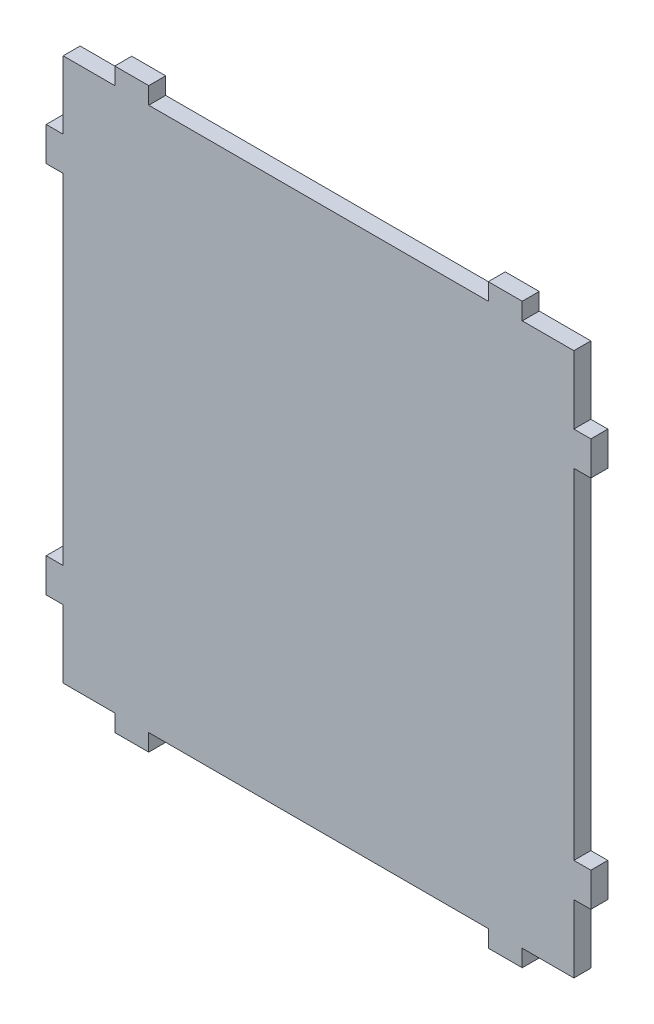
ISO-10303-21;
HEADER;
FILE_DESCRIPTION(('STEP AP214'),'2;1');
FILE_NAME('part.step','',(''),(''),'','','');
FILE_SCHEMA(('AUTOMOTIVE_DESIGN { 1 0 10303 214 1 1 1 1 }'));
ENDSEC;
DATA;
#1=APPLICATION_CONTEXT('core data for automotive mechanical design processes');
#2=APPLICATION_PROTOCOL_DEFINITION('international standard','automotive_design',2000,#1);
#3=PRODUCT_CONTEXT('',#1,'mechanical');
#4=PRODUCT('Part','Part','',(#3));
#5=PRODUCT_RELATED_PRODUCT_CATEGORY('part','',(#4));
#6=PRODUCT_DEFINITION_FORMATION('','',#4);
#7=PRODUCT_DEFINITION_CONTEXT('part definition',#1,'design');
#8=PRODUCT_DEFINITION('design','',#6,#7);
#9=PRODUCT_DEFINITION_SHAPE('','',#8);
#10=(LENGTH_UNIT() NAMED_UNIT(*) SI_UNIT(.MILLI.,.METRE.));
#11=(NAMED_UNIT(*) PLANE_ANGLE_UNIT() SI_UNIT($,.RADIAN.));
#12=(NAMED_UNIT(*) SI_UNIT($,.STERADIAN.) SOLID_ANGLE_UNIT());
#13=UNCERTAINTY_MEASURE_WITH_UNIT(LENGTH_MEASURE(1.E-05),#10,'distance_accuracy_value','');
#14=(GEOMETRIC_REPRESENTATION_CONTEXT(3) GLOBAL_UNCERTAINTY_ASSIGNED_CONTEXT((#13)) GLOBAL_UNIT_ASSIGNED_CONTEXT((#10,
#11,#12)) REPRESENTATION_CONTEXT('',''));
#15=CARTESIAN_POINT('',(0.,0.,0.));
#16=DIRECTION('',(0.,0.,1.));
#17=DIRECTION('',(1.,0.,0.));
#18=AXIS2_PLACEMENT_3D('',#15,#16,#17);
#19=CARTESIAN_POINT('',(-3.17500000000001,0.,3.175));
#20=DIRECTION('',(-1.,0.,0.));
#21=DIRECTION('',(0.,0.,1.));
#22=AXIS2_PLACEMENT_3D('',#19,#20,#21);
#23=PLANE('',#22);
#24=DIRECTION('',(0.,1.,0.));
#25=VECTOR('',#24,1.);
#26=CARTESIAN_POINT('',(-3.17500000000001,0.,0.));
#27=LINE('',#26,#25);
#28=CARTESIAN_POINT('',(-3.17500000000001,-19.05,0.));
#29=VERTEX_POINT('',#28);
#30=CARTESIAN_POINT('',(-3.17500000000001,-12.7,0.));
#31=VERTEX_POINT('',#30);
#32=EDGE_CURVE('E297',#29,#31,#27,.T.);
#33=ORIENTED_EDGE('',*,*,#32,.F.);
#34=DIRECTION('',(0.,0.,-1.));
#35=VECTOR('',#34,1.);
#36=CARTESIAN_POINT('',(-3.17500000000001,-19.05,3.175));
#37=LINE('',#36,#35);
#38=CARTESIAN_POINT('',(-3.17500000000001,-19.05,3.175));
#39=VERTEX_POINT('',#38);
#40=EDGE_CURVE('E11',#39,#29,#37,.T.);
#41=ORIENTED_EDGE('',*,*,#40,.F.);
#42=DIRECTION('',(0.,1.,0.));
#43=VECTOR('',#42,1.);
#44=CARTESIAN_POINT('',(-3.17500000000001,0.,3.175));
#45=LINE('',#44,#43);
#46=CARTESIAN_POINT('',(-3.17500000000001,-12.7,3.175));
#47=VERTEX_POINT('',#46);
#48=EDGE_CURVE('E394',#39,#47,#45,.T.);
#49=ORIENTED_EDGE('',*,*,#48,.T.);
#50=DIRECTION('',(0.,0.,-1.));
#51=VECTOR('',#50,1.);
#52=CARTESIAN_POINT('',(-3.17500000000001,-12.7,3.175));
#53=LINE('',#52,#51);
#54=EDGE_CURVE('E169',#47,#31,#53,.T.);
#55=ORIENTED_EDGE('',*,*,#54,.T.);
#56=EDGE_LOOP('',(#33,#41,#49,#55));
#57=FACE_BOUND('',#56,.T.);
#58=ADVANCED_FACE('F35',(#57),#23,.T.);
#59=CARTESIAN_POINT('',(0.,-19.05,3.175));
#60=DIRECTION('',(0.,-1.,0.));
#61=DIRECTION('',(1.,0.,0.));
#62=AXIS2_PLACEMENT_3D('',#59,#60,#61);
#63=PLANE('',#62);
#64=DIRECTION('',(-1.,0.,0.));
#65=VECTOR('',#64,1.);
#66=CARTESIAN_POINT('',(0.,-19.05,0.));
#67=LINE('',#66,#65);
#68=CARTESIAN_POINT('',(0.,-19.05,0.));
#69=VERTEX_POINT('',#68);
#70=EDGE_CURVE('E300',#69,#29,#67,.T.);
#71=ORIENTED_EDGE('',*,*,#70,.F.);
#72=DIRECTION('',(0.,0.,-1.));
#73=VECTOR('',#72,1.);
#74=CARTESIAN_POINT('',(0.,-19.05,3.175));
#75=LINE('',#74,#73);
#76=CARTESIAN_POINT('',(0.,-19.05,3.175));
#77=VERTEX_POINT('',#76);
#78=EDGE_CURVE('E43',#77,#69,#75,.T.);
#79=ORIENTED_EDGE('',*,*,#78,.F.);
#80=DIRECTION('',(-1.,0.,0.));
#81=VECTOR('',#80,1.);
#82=CARTESIAN_POINT('',(0.,-19.05,3.175));
#83=LINE('',#82,#81);
#84=EDGE_CURVE('E477',#77,#39,#83,.T.);
#85=ORIENTED_EDGE('',*,*,#84,.T.);
#86=ORIENTED_EDGE('',*,*,#40,.T.);
#87=EDGE_LOOP('',(#71,#79,#85,#86));
#88=FACE_BOUND('',#87,.T.);
#89=ADVANCED_FACE('F476',(#88),#63,.T.);
#90=CARTESIAN_POINT('',(0.,0.,3.175));
#91=DIRECTION('',(1.,0.,0.));
#92=DIRECTION('',(0.,1.,0.));
#93=AXIS2_PLACEMENT_3D('',#90,#91,#92);
#94=PLANE('',#93);
#95=DIRECTION('',(0.,-1.,0.));
#96=VECTOR('',#95,1.);
#97=CARTESIAN_POINT('',(0.,0.,0.));
#98=LINE('',#97,#96);
#99=CARTESIAN_POINT('',(0.,-82.55,0.));
#100=VERTEX_POINT('',#99);
#101=EDGE_CURVE('E303',#69,#100,#98,.T.);
#102=ORIENTED_EDGE('',*,*,#101,.T.);
#103=DIRECTION('',(0.,0.,-1.));
#104=VECTOR('',#103,1.);
#105=CARTESIAN_POINT('',(0.,-82.55,3.175));
#106=LINE('',#105,#104);
#107=CARTESIAN_POINT('',(0.,-82.55,3.175));
#108=VERTEX_POINT('',#107);
#109=EDGE_CURVE('E461',#108,#100,#106,.T.);
#110=ORIENTED_EDGE('',*,*,#109,.F.);
#111=DIRECTION('',(0.,-1.,0.));
#112=VECTOR('',#111,1.);
#113=CARTESIAN_POINT('',(0.,0.,3.175));
#114=LINE('',#113,#112);
#115=EDGE_CURVE('E468',#77,#108,#114,.T.);
#116=ORIENTED_EDGE('',*,*,#115,.F.);
#117=ORIENTED_EDGE('',*,*,#78,.T.);
#118=EDGE_LOOP('',(#102,#110,#116,#117));
#119=FACE_BOUND('',#118,.T.);
#120=ADVANCED_FACE('F466',(#119),#94,.F.);
#121=CARTESIAN_POINT('',(0.,-82.55,3.175));
#122=DIRECTION('',(0.,-1.,0.));
#123=DIRECTION('',(0.,0.,-1.));
#124=AXIS2_PLACEMENT_3D('',#121,#122,#123);
#125=PLANE('',#124);
#126=DIRECTION('',(-1.,0.,0.));
#127=VECTOR('',#126,1.);
#128=CARTESIAN_POINT('',(0.,-82.55,0.));
#129=LINE('',#128,#127);
#130=CARTESIAN_POINT('',(-3.17500000000001,-82.55,0.));
#131=VERTEX_POINT('',#130);
#132=EDGE_CURVE('E305',#100,#131,#129,.T.);
#133=ORIENTED_EDGE('',*,*,#132,.T.);
#134=DIRECTION('',(0.,0.,-1.));
#135=VECTOR('',#134,1.);
#136=CARTESIAN_POINT('',(-3.17500000000001,-82.55,3.175));
#137=LINE('',#136,#135);
#138=CARTESIAN_POINT('',(-3.17500000000001,-82.55,3.175));
#139=VERTEX_POINT('',#138);
#140=EDGE_CURVE('E459',#139,#131,#137,.T.);
#141=ORIENTED_EDGE('',*,*,#140,.F.);
#142=DIRECTION('',(-1.,0.,0.));
#143=VECTOR('',#142,1.);
#144=CARTESIAN_POINT('',(0.,-82.55,3.175));
#145=LINE('',#144,#143);
#146=EDGE_CURVE('E485',#108,#139,#145,.T.);
#147=ORIENTED_EDGE('',*,*,#146,.F.);
#148=ORIENTED_EDGE('',*,*,#109,.T.);
#149=EDGE_LOOP('',(#133,#141,#147,#148));
#150=FACE_BOUND('',#149,.T.);
#151=ADVANCED_FACE('F681',(#150),#125,.F.);
#152=CARTESIAN_POINT('',(-3.17500000000001,0.,3.175));
#153=DIRECTION('',(-1.,0.,0.));
#154=DIRECTION('',(0.,0.,1.));
#155=AXIS2_PLACEMENT_3D('',#152,#153,#154);
#156=PLANE('',#155);
#157=DIRECTION('',(0.,1.,0.));
#158=VECTOR('',#157,1.);
#159=CARTESIAN_POINT('',(-3.17500000000001,0.,0.));
#160=LINE('',#159,#158);
#161=CARTESIAN_POINT('',(-3.17500000000001,-88.9,0.));
#162=VERTEX_POINT('',#161);
#163=EDGE_CURVE('E308',#162,#131,#160,.T.);
#164=ORIENTED_EDGE('',*,*,#163,.F.);
#165=DIRECTION('',(0.,0.,-1.));
#166=VECTOR('',#165,1.);
#167=CARTESIAN_POINT('',(-3.17500000000001,-88.9,3.175));
#168=LINE('',#167,#166);
#169=CARTESIAN_POINT('',(-3.17500000000001,-88.9,3.175));
#170=VERTEX_POINT('',#169);
#171=EDGE_CURVE('E457',#170,#162,#168,.T.);
#172=ORIENTED_EDGE('',*,*,#171,.F.);
#173=DIRECTION('',(0.,1.,0.));
#174=VECTOR('',#173,1.);
#175=CARTESIAN_POINT('',(-3.17500000000001,0.,3.175));
#176=LINE('',#175,#174);
#177=EDGE_CURVE('E487',#170,#139,#176,.T.);
#178=ORIENTED_EDGE('',*,*,#177,.T.);
#179=ORIENTED_EDGE('',*,*,#140,.T.);
#180=EDGE_LOOP('',(#164,#172,#178,#179));
#181=FACE_BOUND('',#180,.T.);
#182=ADVANCED_FACE('F677',(#181),#156,.T.);
#183=CARTESIAN_POINT('',(0.,-88.9,3.175));
#184=DIRECTION('',(0.,-1.,0.));
#185=DIRECTION('',(0.,0.,-1.));
#186=AXIS2_PLACEMENT_3D('',#183,#184,#185);
#187=PLANE('',#186);
#188=DIRECTION('',(-1.,0.,0.));
#189=VECTOR('',#188,1.);
#190=CARTESIAN_POINT('',(0.,-88.9,0.));
#191=LINE('',#190,#189);
#192=CARTESIAN_POINT('',(0.,-88.9,0.));
#193=VERTEX_POINT('',#192);
#194=EDGE_CURVE('E311',#193,#162,#191,.T.);
#195=ORIENTED_EDGE('',*,*,#194,.F.);
#196=DIRECTION('',(0.,0.,-1.));
#197=VECTOR('',#196,1.);
#198=CARTESIAN_POINT('',(0.,-88.9,3.175));
#199=LINE('',#198,#197);
#200=CARTESIAN_POINT('',(0.,-88.9,3.175));
#201=VERTEX_POINT('',#200);
#202=EDGE_CURVE('E455',#201,#193,#199,.T.);
#203=ORIENTED_EDGE('',*,*,#202,.F.);
#204=DIRECTION('',(-1.,0.,0.));
#205=VECTOR('',#204,1.);
#206=CARTESIAN_POINT('',(0.,-88.9,3.175));
#207=LINE('',#206,#205);
#208=EDGE_CURVE('E490',#201,#170,#207,.T.);
#209=ORIENTED_EDGE('',*,*,#208,.T.);
#210=ORIENTED_EDGE('',*,*,#171,.T.);
#211=EDGE_LOOP('',(#195,#203,#209,#210));
#212=FACE_BOUND('',#211,.T.);
#213=ADVANCED_FACE('F671',(#212),#187,.T.);
#214=CARTESIAN_POINT('',(0.,0.,3.175));
#215=DIRECTION('',(1.,0.,0.));
#216=DIRECTION('',(0.,1.,0.));
#217=AXIS2_PLACEMENT_3D('',#214,#215,#216);
#218=PLANE('',#217);
#219=DIRECTION('',(0.,-1.,0.));
#220=VECTOR('',#219,1.);
#221=CARTESIAN_POINT('',(0.,0.,0.));
#222=LINE('',#221,#220);
#223=CARTESIAN_POINT('',(0.,-101.6,0.));
#224=VERTEX_POINT('',#223);
#225=EDGE_CURVE('E314',#193,#224,#222,.T.);
#226=ORIENTED_EDGE('',*,*,#225,.T.);
#227=DIRECTION('',(0.,0.,-1.));
#228=VECTOR('',#227,1.);
#229=CARTESIAN_POINT('',(0.,-101.6,3.175));
#230=LINE('',#229,#228);
#231=CARTESIAN_POINT('',(0.,-101.6,3.175));
#232=VERTEX_POINT('',#231);
#233=EDGE_CURVE('E452',#232,#224,#230,.T.);
#234=ORIENTED_EDGE('',*,*,#233,.F.);
#235=DIRECTION('',(0.,-1.,0.));
#236=VECTOR('',#235,1.);
#237=CARTESIAN_POINT('',(0.,0.,3.175));
#238=LINE('',#237,#236);
#239=EDGE_CURVE('E493',#201,#232,#238,.T.);
#240=ORIENTED_EDGE('',*,*,#239,.F.);
#241=ORIENTED_EDGE('',*,*,#202,.T.);
#242=EDGE_LOOP('',(#226,#234,#240,#241));
#243=FACE_BOUND('',#242,.T.);
#244=ADVANCED_FACE('F682',(#243),#218,.F.);
#245=CARTESIAN_POINT('',(0.,-101.6,3.175));
#246=DIRECTION('',(0.,1.,0.));
#247=DIRECTION('',(0.,0.,1.));
#248=AXIS2_PLACEMENT_3D('',#245,#246,#247);
#249=PLANE('',#248);
#250=DIRECTION('',(1.,0.,0.));
#251=VECTOR('',#250,1.);
#252=CARTESIAN_POINT('',(0.,-101.6,0.));
#253=LINE('',#252,#251);
#254=CARTESIAN_POINT('',(9.65200000000001,-101.6,0.));
#255=VERTEX_POINT('',#254);
#256=EDGE_CURVE('E316',#224,#255,#253,.T.);
#257=ORIENTED_EDGE('',*,*,#256,.T.);
#258=DIRECTION('',(0.,0.,-1.));
#259=VECTOR('',#258,1.);
#260=CARTESIAN_POINT('',(9.65200000000001,-101.6,3.175));
#261=LINE('',#260,#259);
#262=CARTESIAN_POINT('',(9.65200000000001,-101.6,3.175));
#263=VERTEX_POINT('',#262);
#264=EDGE_CURVE('E449',#263,#255,#261,.T.);
#265=ORIENTED_EDGE('',*,*,#264,.F.);
#266=DIRECTION('',(1.,0.,0.));
#267=VECTOR('',#266,1.);
#268=CARTESIAN_POINT('',(0.,-101.6,3.175));
#269=LINE('',#268,#267);
#270=EDGE_CURVE('E495',#232,#263,#269,.T.);
#271=ORIENTED_EDGE('',*,*,#270,.F.);
#272=ORIENTED_EDGE('',*,*,#233,.T.);
#273=EDGE_LOOP('',(#257,#265,#271,#272));
#274=FACE_BOUND('',#273,.T.);
#275=ADVANCED_FACE('F665',(#274),#249,.F.);
#276=CARTESIAN_POINT('',(9.65200000000001,0.,3.175));
#277=DIRECTION('',(1.,0.,0.));
#278=DIRECTION('',(0.,0.,-1.));
#279=AXIS2_PLACEMENT_3D('',#276,#277,#278);
#280=PLANE('',#279);
#281=DIRECTION('',(0.,-1.,0.));
#282=VECTOR('',#281,1.);
#283=CARTESIAN_POINT('',(9.65200000000001,0.,0.));
#284=LINE('',#283,#282);
#285=CARTESIAN_POINT('',(9.65200000000001,-104.775,0.));
#286=VERTEX_POINT('',#285);
#287=EDGE_CURVE('E318',#255,#286,#284,.T.);
#288=ORIENTED_EDGE('',*,*,#287,.T.);
#289=DIRECTION('',(0.,0.,-1.));
#290=VECTOR('',#289,1.);
#291=CARTESIAN_POINT('',(9.65200000000001,-104.775,3.175));
#292=LINE('',#291,#290);
#293=CARTESIAN_POINT('',(9.65200000000001,-104.775,3.175));
#294=VERTEX_POINT('',#293);
#295=EDGE_CURVE('E446',#294,#286,#292,.T.);
#296=ORIENTED_EDGE('',*,*,#295,.F.);
#297=DIRECTION('',(0.,-1.,0.));
#298=VECTOR('',#297,1.);
#299=CARTESIAN_POINT('',(9.65200000000001,0.,3.175));
#300=LINE('',#299,#298);
#301=EDGE_CURVE('E497',#263,#294,#300,.T.);
#302=ORIENTED_EDGE('',*,*,#301,.F.);
#303=ORIENTED_EDGE('',*,*,#264,.T.);
#304=EDGE_LOOP('',(#288,#296,#302,#303));
#305=FACE_BOUND('',#304,.T.);
#306=ADVANCED_FACE('F661',(#305),#280,.F.);
#307=CARTESIAN_POINT('',(0.,-104.775,3.175));
#308=DIRECTION('',(0.,1.,0.));
#309=DIRECTION('',(0.,0.,1.));
#310=AXIS2_PLACEMENT_3D('',#307,#308,#309);
#311=PLANE('',#310);
#312=DIRECTION('',(1.,0.,0.));
#313=VECTOR('',#312,1.);
#314=CARTESIAN_POINT('',(0.,-104.775,0.));
#315=LINE('',#314,#313);
#316=CARTESIAN_POINT('',(16.002,-104.775,0.));
#317=VERTEX_POINT('',#316);
#318=EDGE_CURVE('E320',#286,#317,#315,.T.);
#319=ORIENTED_EDGE('',*,*,#318,.T.);
#320=DIRECTION('',(0.,0.,-1.));
#321=VECTOR('',#320,1.);
#322=CARTESIAN_POINT('',(16.002,-104.775,3.175));
#323=LINE('',#322,#321);
#324=CARTESIAN_POINT('',(16.002,-104.775,3.175));
#325=VERTEX_POINT('',#324);
#326=EDGE_CURVE('E444',#325,#317,#323,.T.);
#327=ORIENTED_EDGE('',*,*,#326,.F.);
#328=DIRECTION('',(1.,0.,0.));
#329=VECTOR('',#328,1.);
#330=CARTESIAN_POINT('',(0.,-104.775,3.175));
#331=LINE('',#330,#329);
#332=EDGE_CURVE('E499',#294,#325,#331,.T.);
#333=ORIENTED_EDGE('',*,*,#332,.F.);
#334=ORIENTED_EDGE('',*,*,#295,.T.);
#335=EDGE_LOOP('',(#319,#327,#333,#334));
#336=FACE_BOUND('',#335,.T.);
#337=ADVANCED_FACE('F656',(#336),#311,.F.);
#338=CARTESIAN_POINT('',(16.002,0.,3.175));
#339=DIRECTION('',(1.,0.,0.));
#340=DIRECTION('',(0.,0.,-1.));
#341=AXIS2_PLACEMENT_3D('',#338,#339,#340);
#342=PLANE('',#341);
#343=DIRECTION('',(0.,-1.,0.));
#344=VECTOR('',#343,1.);
#345=CARTESIAN_POINT('',(16.002,0.,0.));
#346=LINE('',#345,#344);
#347=CARTESIAN_POINT('',(16.002,-101.6,0.));
#348=VERTEX_POINT('',#347);
#349=EDGE_CURVE('E323',#348,#317,#346,.T.);
#350=ORIENTED_EDGE('',*,*,#349,.F.);
#351=DIRECTION('',(0.,0.,-1.));
#352=VECTOR('',#351,1.);
#353=CARTESIAN_POINT('',(16.002,-101.6,3.175));
#354=LINE('',#353,#352);
#355=CARTESIAN_POINT('',(16.002,-101.6,3.175));
#356=VERTEX_POINT('',#355);
#357=EDGE_CURVE('E442',#356,#348,#354,.T.);
#358=ORIENTED_EDGE('',*,*,#357,.F.);
#359=DIRECTION('',(0.,-1.,0.));
#360=VECTOR('',#359,1.);
#361=CARTESIAN_POINT('',(16.002,0.,3.175));
#362=LINE('',#361,#360);
#363=EDGE_CURVE('E501',#356,#325,#362,.T.);
#364=ORIENTED_EDGE('',*,*,#363,.T.);
#365=ORIENTED_EDGE('',*,*,#326,.T.);
#366=EDGE_LOOP('',(#350,#358,#364,#365));
#367=FACE_BOUND('',#366,.T.);
#368=ADVANCED_FACE('F650',(#367),#342,.T.);
#369=CARTESIAN_POINT('',(1.33226762955019E-13,-101.6,3.175));
#370=DIRECTION('',(0.,1.,0.));
#371=DIRECTION('',(-1.,0.,0.));
#372=AXIS2_PLACEMENT_3D('',#369,#370,#371);
#373=PLANE('',#372);
#374=DIRECTION('',(1.,0.,0.));
#375=VECTOR('',#374,1.);
#376=CARTESIAN_POINT('',(1.33226762955019E-13,-101.6,0.));
#377=LINE('',#376,#375);
#378=CARTESIAN_POINT('',(79.502,-101.6,0.));
#379=VERTEX_POINT('',#378);
#380=EDGE_CURVE('E326',#348,#379,#377,.T.);
#381=ORIENTED_EDGE('',*,*,#380,.T.);
#382=DIRECTION('',(0.,0.,-1.));
#383=VECTOR('',#382,1.);
#384=CARTESIAN_POINT('',(79.502,-101.6,3.175));
#385=LINE('',#384,#383);
#386=CARTESIAN_POINT('',(79.502,-101.6,3.175));
#387=VERTEX_POINT('',#386);
#388=EDGE_CURVE('E439',#387,#379,#385,.T.);
#389=ORIENTED_EDGE('',*,*,#388,.F.);
#390=DIRECTION('',(1.,0.,0.));
#391=VECTOR('',#390,1.);
#392=CARTESIAN_POINT('',(1.33226762955019E-13,-101.6,3.175));
#393=LINE('',#392,#391);
#394=EDGE_CURVE('E504',#356,#387,#393,.T.);
#395=ORIENTED_EDGE('',*,*,#394,.F.);
#396=ORIENTED_EDGE('',*,*,#357,.T.);
#397=EDGE_LOOP('',(#381,#389,#395,#396));
#398=FACE_BOUND('',#397,.T.);
#399=ADVANCED_FACE('F647',(#398),#373,.F.);
#400=CARTESIAN_POINT('',(79.502,0.,3.175));
#401=DIRECTION('',(1.,0.,0.));
#402=DIRECTION('',(0.,0.,-1.));
#403=AXIS2_PLACEMENT_3D('',#400,#401,#402);
#404=PLANE('',#403);
#405=DIRECTION('',(0.,-1.,0.));
#406=VECTOR('',#405,1.);
#407=CARTESIAN_POINT('',(79.502,0.,0.));
#408=LINE('',#407,#406);
#409=CARTESIAN_POINT('',(79.502,-104.775,0.));
#410=VERTEX_POINT('',#409);
#411=EDGE_CURVE('E328',#379,#410,#408,.T.);
#412=ORIENTED_EDGE('',*,*,#411,.T.);
#413=DIRECTION('',(0.,0.,-1.));
#414=VECTOR('',#413,1.);
#415=CARTESIAN_POINT('',(79.502,-104.775,3.175));
#416=LINE('',#415,#414);
#417=CARTESIAN_POINT('',(79.502,-104.775,3.175));
#418=VERTEX_POINT('',#417);
#419=EDGE_CURVE('E436',#418,#410,#416,.T.);
#420=ORIENTED_EDGE('',*,*,#419,.F.);
#421=DIRECTION('',(0.,-1.,0.));
#422=VECTOR('',#421,1.);
#423=CARTESIAN_POINT('',(79.502,0.,3.175));
#424=LINE('',#423,#422);
#425=EDGE_CURVE('E506',#387,#418,#424,.T.);
#426=ORIENTED_EDGE('',*,*,#425,.F.);
#427=ORIENTED_EDGE('',*,*,#388,.T.);
#428=EDGE_LOOP('',(#412,#420,#426,#427));
#429=FACE_BOUND('',#428,.T.);
#430=ADVANCED_FACE('F642',(#429),#404,.F.);
#431=CARTESIAN_POINT('',(0.,-104.775,3.175));
#432=DIRECTION('',(0.,1.,0.));
#433=DIRECTION('',(0.,0.,1.));
#434=AXIS2_PLACEMENT_3D('',#431,#432,#433);
#435=PLANE('',#434);
#436=DIRECTION('',(1.,0.,0.));
#437=VECTOR('',#436,1.);
#438=CARTESIAN_POINT('',(0.,-104.775,0.));
#439=LINE('',#438,#437);
#440=CARTESIAN_POINT('',(85.852,-104.775,0.));
#441=VERTEX_POINT('',#440);
#442=EDGE_CURVE('E330',#410,#441,#439,.T.);
#443=ORIENTED_EDGE('',*,*,#442,.T.);
#444=DIRECTION('',(0.,0.,-1.));
#445=VECTOR('',#444,1.);
#446=CARTESIAN_POINT('',(85.852,-104.775,3.175));
#447=LINE('',#446,#445);
#448=CARTESIAN_POINT('',(85.852,-104.775,3.175));
#449=VERTEX_POINT('',#448);
#450=EDGE_CURVE('E434',#449,#441,#447,.T.);
#451=ORIENTED_EDGE('',*,*,#450,.F.);
#452=DIRECTION('',(1.,0.,0.));
#453=VECTOR('',#452,1.);
#454=CARTESIAN_POINT('',(0.,-104.775,3.175));
#455=LINE('',#454,#453);
#456=EDGE_CURVE('E508',#418,#449,#455,.T.);
#457=ORIENTED_EDGE('',*,*,#456,.F.);
#458=ORIENTED_EDGE('',*,*,#419,.T.);
#459=EDGE_LOOP('',(#443,#451,#457,#458));
#460=FACE_BOUND('',#459,.T.);
#461=ADVANCED_FACE('F636',(#460),#435,.F.);
#462=CARTESIAN_POINT('',(85.852,0.,3.175));
#463=DIRECTION('',(1.,0.,0.));
#464=DIRECTION('',(0.,0.,-1.));
#465=AXIS2_PLACEMENT_3D('',#462,#463,#464);
#466=PLANE('',#465);
#467=DIRECTION('',(0.,-1.,0.));
#468=VECTOR('',#467,1.);
#469=CARTESIAN_POINT('',(85.852,0.,0.));
#470=LINE('',#469,#468);
#471=CARTESIAN_POINT('',(85.852,-101.6,0.));
#472=VERTEX_POINT('',#471);
#473=EDGE_CURVE('E333',#472,#441,#470,.T.);
#474=ORIENTED_EDGE('',*,*,#473,.F.);
#475=DIRECTION('',(0.,0.,-1.));
#476=VECTOR('',#475,1.);
#477=CARTESIAN_POINT('',(85.852,-101.6,3.175));
#478=LINE('',#477,#476);
#479=CARTESIAN_POINT('',(85.852,-101.6,3.175));
#480=VERTEX_POINT('',#479);
#481=EDGE_CURVE('E432',#480,#472,#478,.T.);
#482=ORIENTED_EDGE('',*,*,#481,.F.);
#483=DIRECTION('',(0.,-1.,0.));
#484=VECTOR('',#483,1.);
#485=CARTESIAN_POINT('',(85.852,0.,3.175));
#486=LINE('',#485,#484);
#487=EDGE_CURVE('E510',#480,#449,#486,.T.);
#488=ORIENTED_EDGE('',*,*,#487,.T.);
#489=ORIENTED_EDGE('',*,*,#450,.T.);
#490=EDGE_LOOP('',(#474,#482,#488,#489));
#491=FACE_BOUND('',#490,.T.);
#492=ADVANCED_FACE('F630',(#491),#466,.T.);
#493=CARTESIAN_POINT('',(0.,-101.6,3.175));
#494=DIRECTION('',(0.,1.,0.));
#495=DIRECTION('',(0.,0.,1.));
#496=AXIS2_PLACEMENT_3D('',#493,#494,#495);
#497=PLANE('',#496);
#498=DIRECTION('',(1.,0.,0.));
#499=VECTOR('',#498,1.);
#500=CARTESIAN_POINT('',(0.,-101.6,0.));
#501=LINE('',#500,#499);
#502=CARTESIAN_POINT('',(95.504,-101.6,0.));
#503=VERTEX_POINT('',#502);
#504=EDGE_CURVE('E336',#472,#503,#501,.T.);
#505=ORIENTED_EDGE('',*,*,#504,.T.);
#506=DIRECTION('',(0.,0.,-1.));
#507=VECTOR('',#506,1.);
#508=CARTESIAN_POINT('',(95.504,-101.6,3.175));
#509=LINE('',#508,#507);
#510=CARTESIAN_POINT('',(95.504,-101.6,3.175));
#511=VERTEX_POINT('',#510);
#512=EDGE_CURVE('E430',#511,#503,#509,.T.);
#513=ORIENTED_EDGE('',*,*,#512,.F.);
#514=DIRECTION('',(1.,0.,0.));
#515=VECTOR('',#514,1.);
#516=CARTESIAN_POINT('',(0.,-101.6,3.175));
#517=LINE('',#516,#515);
#518=EDGE_CURVE('E513',#480,#511,#517,.T.);
#519=ORIENTED_EDGE('',*,*,#518,.F.);
#520=ORIENTED_EDGE('',*,*,#481,.T.);
#521=EDGE_LOOP('',(#505,#513,#519,#520));
#522=FACE_BOUND('',#521,.T.);
#523=ADVANCED_FACE('F778',(#522),#497,.F.);
#524=CARTESIAN_POINT('',(95.504,0.,3.175));
#525=DIRECTION('',(1.,0.,0.));
#526=DIRECTION('',(0.,0.,-1.));
#527=AXIS2_PLACEMENT_3D('',#524,#525,#526);
#528=PLANE('',#527);
#529=DIRECTION('',(0.,-1.,0.));
#530=VECTOR('',#529,1.);
#531=CARTESIAN_POINT('',(95.504,0.,0.));
#532=LINE('',#531,#530);
#533=CARTESIAN_POINT('',(95.504,-88.9,0.));
#534=VERTEX_POINT('',#533);
#535=EDGE_CURVE('E339',#534,#503,#532,.T.);
#536=ORIENTED_EDGE('',*,*,#535,.F.);
#537=DIRECTION('',(0.,0.,-1.));
#538=VECTOR('',#537,1.);
#539=CARTESIAN_POINT('',(95.504,-88.9,3.175));
#540=LINE('',#539,#538);
#541=CARTESIAN_POINT('',(95.504,-88.9,3.175));
#542=VERTEX_POINT('',#541);
#543=EDGE_CURVE('E428',#542,#534,#540,.T.);
#544=ORIENTED_EDGE('',*,*,#543,.F.);
#545=DIRECTION('',(0.,-1.,0.));
#546=VECTOR('',#545,1.);
#547=CARTESIAN_POINT('',(95.504,0.,3.175));
#548=LINE('',#547,#546);
#549=EDGE_CURVE('E515',#542,#511,#548,.T.);
#550=ORIENTED_EDGE('',*,*,#549,.T.);
#551=ORIENTED_EDGE('',*,*,#512,.T.);
#552=EDGE_LOOP('',(#536,#544,#550,#551));
#553=FACE_BOUND('',#552,.T.);
#554=ADVANCED_FACE('F623',(#553),#528,.T.);
#555=CARTESIAN_POINT('',(0.,-88.9,3.175));
#556=DIRECTION('',(0.,1.,0.));
#557=DIRECTION('',(0.,0.,1.));
#558=AXIS2_PLACEMENT_3D('',#555,#556,#557);
#559=PLANE('',#558);
#560=DIRECTION('',(1.,0.,0.));
#561=VECTOR('',#560,1.);
#562=CARTESIAN_POINT('',(0.,-88.9,0.));
#563=LINE('',#562,#561);
#564=CARTESIAN_POINT('',(98.679,-88.9,0.));
#565=VERTEX_POINT('',#564);
#566=EDGE_CURVE('E342',#534,#565,#563,.T.);
#567=ORIENTED_EDGE('',*,*,#566,.T.);
#568=DIRECTION('',(0.,0.,-1.));
#569=VECTOR('',#568,1.);
#570=CARTESIAN_POINT('',(98.679,-88.9,3.175));
#571=LINE('',#570,#569);
#572=CARTESIAN_POINT('',(98.679,-88.9,3.175));
#573=VERTEX_POINT('',#572);
#574=EDGE_CURVE('E426',#573,#565,#571,.T.);
#575=ORIENTED_EDGE('',*,*,#574,.F.);
#576=DIRECTION('',(1.,0.,0.));
#577=VECTOR('',#576,1.);
#578=CARTESIAN_POINT('',(0.,-88.9,3.175));
#579=LINE('',#578,#577);
#580=EDGE_CURVE('E518',#542,#573,#579,.T.);
#581=ORIENTED_EDGE('',*,*,#580,.F.);
#582=ORIENTED_EDGE('',*,*,#543,.T.);
#583=EDGE_LOOP('',(#567,#575,#581,#582));
#584=FACE_BOUND('',#583,.T.);
#585=ADVANCED_FACE('F620',(#584),#559,.F.);
#586=CARTESIAN_POINT('',(98.6789999999998,2.15660822533437E-13,3.175));
#587=DIRECTION('',(1.,0.,0.));
#588=DIRECTION('',(0.,1.,0.));
#589=AXIS2_PLACEMENT_3D('',#586,#587,#588);
#590=PLANE('',#589);
#591=DIRECTION('',(0.,-1.,0.));
#592=VECTOR('',#591,1.);
#593=CARTESIAN_POINT('',(98.6789999999998,2.15660822533437E-13,0.));
#594=LINE('',#593,#592);
#595=CARTESIAN_POINT('',(98.679,-82.55,0.));
#596=VERTEX_POINT('',#595);
#597=EDGE_CURVE('E345',#596,#565,#594,.T.);
#598=ORIENTED_EDGE('',*,*,#597,.F.);
#599=DIRECTION('',(0.,0.,-1.));
#600=VECTOR('',#599,1.);
#601=CARTESIAN_POINT('',(98.679,-82.55,3.175));
#602=LINE('',#601,#600);
#603=CARTESIAN_POINT('',(98.679,-82.55,3.175));
#604=VERTEX_POINT('',#603);
#605=EDGE_CURVE('E424',#604,#596,#602,.T.);
#606=ORIENTED_EDGE('',*,*,#605,.F.);
#607=DIRECTION('',(0.,-1.,0.));
#608=VECTOR('',#607,1.);
#609=CARTESIAN_POINT('',(98.6789999999998,2.15660822533437E-13,3.175));
#610=LINE('',#609,#608);
#611=EDGE_CURVE('E520',#604,#573,#610,.T.);
#612=ORIENTED_EDGE('',*,*,#611,.T.);
#613=ORIENTED_EDGE('',*,*,#574,.T.);
#614=EDGE_LOOP('',(#598,#606,#612,#613));
#615=FACE_BOUND('',#614,.T.);
#616=ADVANCED_FACE('F615',(#615),#590,.T.);
#617=CARTESIAN_POINT('',(0.,-82.55,3.175));
#618=DIRECTION('',(0.,1.,0.));
#619=DIRECTION('',(0.,0.,1.));
#620=AXIS2_PLACEMENT_3D('',#617,#618,#619);
#621=PLANE('',#620);
#622=DIRECTION('',(1.,0.,0.));
#623=VECTOR('',#622,1.);
#624=CARTESIAN_POINT('',(0.,-82.55,0.));
#625=LINE('',#624,#623);
#626=CARTESIAN_POINT('',(95.504,-82.55,0.));
#627=VERTEX_POINT('',#626);
#628=EDGE_CURVE('E348',#627,#596,#625,.T.);
#629=ORIENTED_EDGE('',*,*,#628,.F.);
#630=DIRECTION('',(0.,0.,-1.));
#631=VECTOR('',#630,1.);
#632=CARTESIAN_POINT('',(95.504,-82.55,3.175));
#633=LINE('',#632,#631);
#634=CARTESIAN_POINT('',(95.504,-82.55,3.175));
#635=VERTEX_POINT('',#634);
#636=EDGE_CURVE('E422',#635,#627,#633,.T.);
#637=ORIENTED_EDGE('',*,*,#636,.F.);
#638=DIRECTION('',(1.,0.,0.));
#639=VECTOR('',#638,1.);
#640=CARTESIAN_POINT('',(0.,-82.55,3.175));
#641=LINE('',#640,#639);
#642=EDGE_CURVE('E523',#635,#604,#641,.T.);
#643=ORIENTED_EDGE('',*,*,#642,.T.);
#644=ORIENTED_EDGE('',*,*,#605,.T.);
#645=EDGE_LOOP('',(#629,#637,#643,#644));
#646=FACE_BOUND('',#645,.T.);
#647=ADVANCED_FACE('F610',(#646),#621,.T.);
#648=CARTESIAN_POINT('',(95.504,0.,3.175));
#649=DIRECTION('',(1.,0.,0.));
#650=DIRECTION('',(0.,1.,0.));
#651=AXIS2_PLACEMENT_3D('',#648,#649,#650);
#652=PLANE('',#651);
#653=DIRECTION('',(0.,-1.,0.));
#654=VECTOR('',#653,1.);
#655=CARTESIAN_POINT('',(95.504,0.,0.));
#656=LINE('',#655,#654);
#657=CARTESIAN_POINT('',(95.504,-19.05,0.));
#658=VERTEX_POINT('',#657);
#659=EDGE_CURVE('E351',#658,#627,#656,.T.);
#660=ORIENTED_EDGE('',*,*,#659,.F.);
#661=DIRECTION('',(0.,0.,-1.));
#662=VECTOR('',#661,1.);
#663=CARTESIAN_POINT('',(95.504,-19.05,3.175));
#664=LINE('',#663,#662);
#665=CARTESIAN_POINT('',(95.504,-19.05,3.175));
#666=VERTEX_POINT('',#665);
#667=EDGE_CURVE('E420',#666,#658,#664,.T.);
#668=ORIENTED_EDGE('',*,*,#667,.F.);
#669=DIRECTION('',(0.,-1.,0.));
#670=VECTOR('',#669,1.);
#671=CARTESIAN_POINT('',(95.504,0.,3.175));
#672=LINE('',#671,#670);
#673=EDGE_CURVE('E526',#666,#635,#672,.T.);
#674=ORIENTED_EDGE('',*,*,#673,.T.);
#675=ORIENTED_EDGE('',*,*,#636,.T.);
#676=EDGE_LOOP('',(#660,#668,#674,#675));
#677=FACE_BOUND('',#676,.T.);
#678=ADVANCED_FACE('F604',(#677),#652,.T.);
#679=CARTESIAN_POINT('',(0.,-19.05,3.175));
#680=DIRECTION('',(0.,1.,0.));
#681=DIRECTION('',(0.,0.,1.));
#682=AXIS2_PLACEMENT_3D('',#679,#680,#681);
#683=PLANE('',#682);
#684=DIRECTION('',(1.,0.,0.));
#685=VECTOR('',#684,1.);
#686=CARTESIAN_POINT('',(0.,-19.05,0.));
#687=LINE('',#686,#685);
#688=CARTESIAN_POINT('',(98.679,-19.05,0.));
#689=VERTEX_POINT('',#688);
#690=EDGE_CURVE('E354',#658,#689,#687,.T.);
#691=ORIENTED_EDGE('',*,*,#690,.T.);
#692=DIRECTION('',(0.,0.,-1.));
#693=VECTOR('',#692,1.);
#694=CARTESIAN_POINT('',(98.679,-19.05,3.175));
#695=LINE('',#694,#693);
#696=CARTESIAN_POINT('',(98.679,-19.05,3.175));
#697=VERTEX_POINT('',#696);
#698=EDGE_CURVE('E418',#697,#689,#695,.T.);
#699=ORIENTED_EDGE('',*,*,#698,.F.);
#700=DIRECTION('',(1.,0.,0.));
#701=VECTOR('',#700,1.);
#702=CARTESIAN_POINT('',(0.,-19.05,3.175));
#703=LINE('',#702,#701);
#704=EDGE_CURVE('E529',#666,#697,#703,.T.);
#705=ORIENTED_EDGE('',*,*,#704,.F.);
#706=ORIENTED_EDGE('',*,*,#667,.T.);
#707=EDGE_LOOP('',(#691,#699,#705,#706));
#708=FACE_BOUND('',#707,.T.);
#709=ADVANCED_FACE('F827',(#708),#683,.F.);
#710=CARTESIAN_POINT('',(98.679,0.,3.175));
#711=DIRECTION('',(1.,0.,0.));
#712=DIRECTION('',(0.,0.,-1.));
#713=AXIS2_PLACEMENT_3D('',#710,#711,#712);
#714=PLANE('',#713);
#715=DIRECTION('',(0.,-1.,0.));
#716=VECTOR('',#715,1.);
#717=CARTESIAN_POINT('',(98.679,0.,0.));
#718=LINE('',#717,#716);
#719=CARTESIAN_POINT('',(98.679,-12.7,0.));
#720=VERTEX_POINT('',#719);
#721=EDGE_CURVE('E357',#720,#689,#718,.T.);
#722=ORIENTED_EDGE('',*,*,#721,.F.);
#723=DIRECTION('',(0.,0.,-1.));
#724=VECTOR('',#723,1.);
#725=CARTESIAN_POINT('',(98.679,-12.7,3.175));
#726=LINE('',#725,#724);
#727=CARTESIAN_POINT('',(98.679,-12.7,3.175));
#728=VERTEX_POINT('',#727);
#729=EDGE_CURVE('E416',#728,#720,#726,.T.);
#730=ORIENTED_EDGE('',*,*,#729,.F.);
#731=DIRECTION('',(0.,-1.,0.));
#732=VECTOR('',#731,1.);
#733=CARTESIAN_POINT('',(98.679,0.,3.175));
#734=LINE('',#733,#732);
#735=EDGE_CURVE('E531',#728,#697,#734,.T.);
#736=ORIENTED_EDGE('',*,*,#735,.T.);
#737=ORIENTED_EDGE('',*,*,#698,.T.);
#738=EDGE_LOOP('',(#722,#730,#736,#737));
#739=FACE_BOUND('',#738,.T.);
#740=ADVANCED_FACE('F598',(#739),#714,.T.);
#741=CARTESIAN_POINT('',(0.,-12.7,3.175));
#742=DIRECTION('',(0.,1.,0.));
#743=DIRECTION('',(0.,0.,1.));
#744=AXIS2_PLACEMENT_3D('',#741,#742,#743);
#745=PLANE('',#744);
#746=DIRECTION('',(1.,0.,0.));
#747=VECTOR('',#746,1.);
#748=CARTESIAN_POINT('',(0.,-12.7,0.));
#749=LINE('',#748,#747);
#750=CARTESIAN_POINT('',(95.504,-12.7,0.));
#751=VERTEX_POINT('',#750);
#752=EDGE_CURVE('E360',#751,#720,#749,.T.);
#753=ORIENTED_EDGE('',*,*,#752,.F.);
#754=DIRECTION('',(0.,0.,-1.));
#755=VECTOR('',#754,1.);
#756=CARTESIAN_POINT('',(95.504,-12.7,3.175));
#757=LINE('',#756,#755);
#758=CARTESIAN_POINT('',(95.504,-12.7,3.175));
#759=VERTEX_POINT('',#758);
#760=EDGE_CURVE('E414',#759,#751,#757,.T.);
#761=ORIENTED_EDGE('',*,*,#760,.F.);
#762=DIRECTION('',(1.,0.,0.));
#763=VECTOR('',#762,1.);
#764=CARTESIAN_POINT('',(0.,-12.7,3.175));
#765=LINE('',#764,#763);
#766=EDGE_CURVE('E534',#759,#728,#765,.T.);
#767=ORIENTED_EDGE('',*,*,#766,.T.);
#768=ORIENTED_EDGE('',*,*,#729,.T.);
#769=EDGE_LOOP('',(#753,#761,#767,#768));
#770=FACE_BOUND('',#769,.T.);
#771=ADVANCED_FACE('F594',(#770),#745,.T.);
#772=CARTESIAN_POINT('',(95.504,-1.04360964314765E-13,3.175));
#773=DIRECTION('',(1.,0.,0.));
#774=DIRECTION('',(0.,1.,0.));
#775=AXIS2_PLACEMENT_3D('',#772,#773,#774);
#776=PLANE('',#775);
#777=DIRECTION('',(0.,-1.,0.));
#778=VECTOR('',#777,1.);
#779=CARTESIAN_POINT('',(95.504,-1.04360964314765E-13,0.));
#780=LINE('',#779,#778);
#781=CARTESIAN_POINT('',(95.504,0.,0.));
#782=VERTEX_POINT('',#781);
#783=EDGE_CURVE('E363',#782,#751,#780,.T.);
#784=ORIENTED_EDGE('',*,*,#783,.F.);
#785=DIRECTION('',(0.,0.,-1.));
#786=VECTOR('',#785,1.);
#787=CARTESIAN_POINT('',(95.504,0.,3.175));
#788=LINE('',#787,#786);
#789=CARTESIAN_POINT('',(95.504,0.,3.175));
#790=VERTEX_POINT('',#789);
#791=EDGE_CURVE('E412',#790,#782,#788,.T.);
#792=ORIENTED_EDGE('',*,*,#791,.F.);
#793=DIRECTION('',(0.,-1.,0.));
#794=VECTOR('',#793,1.);
#795=CARTESIAN_POINT('',(95.504,-1.04360964314765E-13,3.175));
#796=LINE('',#795,#794);
#797=EDGE_CURVE('E537',#790,#759,#796,.T.);
#798=ORIENTED_EDGE('',*,*,#797,.T.);
#799=ORIENTED_EDGE('',*,*,#760,.T.);
#800=EDGE_LOOP('',(#784,#792,#798,#799));
#801=FACE_BOUND('',#800,.T.);
#802=ADVANCED_FACE('F590',(#801),#776,.T.);
#803=CARTESIAN_POINT('',(0.,-2.59204207805166E-13,3.175));
#804=DIRECTION('',(0.,1.,0.));
#805=DIRECTION('',(-1.,0.,0.));
#806=AXIS2_PLACEMENT_3D('',#803,#804,#805);
#807=PLANE('',#806);
#808=DIRECTION('',(1.,0.,0.));
#809=VECTOR('',#808,1.);
#810=CARTESIAN_POINT('',(0.,-2.59204207805166E-13,0.));
#811=LINE('',#810,#809);
#812=CARTESIAN_POINT('',(85.852,0.,0.));
#813=VERTEX_POINT('',#812);
#814=EDGE_CURVE('E366',#813,#782,#811,.T.);
#815=ORIENTED_EDGE('',*,*,#814,.F.);
#816=DIRECTION('',(0.,0.,-1.));
#817=VECTOR('',#816,1.);
#818=CARTESIAN_POINT('',(85.852,0.,3.175));
#819=LINE('',#818,#817);
#820=CARTESIAN_POINT('',(85.852,0.,3.175));
#821=VERTEX_POINT('',#820);
#822=EDGE_CURVE('E410',#821,#813,#819,.T.);
#823=ORIENTED_EDGE('',*,*,#822,.F.);
#824=DIRECTION('',(1.,0.,0.));
#825=VECTOR('',#824,1.);
#826=CARTESIAN_POINT('',(0.,-2.59204207805166E-13,3.175));
#827=LINE('',#826,#825);
#828=EDGE_CURVE('E540',#821,#790,#827,.T.);
#829=ORIENTED_EDGE('',*,*,#828,.T.);
#830=ORIENTED_EDGE('',*,*,#791,.T.);
#831=EDGE_LOOP('',(#815,#823,#829,#830));
#832=FACE_BOUND('',#831,.T.);
#833=ADVANCED_FACE('F586',(#832),#807,.T.);
#834=CARTESIAN_POINT('',(85.852,3.75255382323303E-13,3.175));
#835=DIRECTION('',(-1.,0.,0.));
#836=DIRECTION('',(0.,-1.,0.));
#837=AXIS2_PLACEMENT_3D('',#834,#835,#836);
#838=PLANE('',#837);
#839=DIRECTION('',(0.,1.,0.));
#840=VECTOR('',#839,1.);
#841=CARTESIAN_POINT('',(85.852,3.75255382323303E-13,0.));
#842=LINE('',#841,#840);
#843=CARTESIAN_POINT('',(85.852,3.17499999999997,0.));
#844=VERTEX_POINT('',#843);
#845=EDGE_CURVE('E369',#813,#844,#842,.T.);
#846=ORIENTED_EDGE('',*,*,#845,.T.);
#847=DIRECTION('',(0.,0.,-1.));
#848=VECTOR('',#847,1.);
#849=CARTESIAN_POINT('',(85.852,3.17499999999997,3.175));
#850=LINE('',#849,#848);
#851=CARTESIAN_POINT('',(85.852,3.17499999999997,3.175));
#852=VERTEX_POINT('',#851);
#853=EDGE_CURVE('E408',#852,#844,#850,.T.);
#854=ORIENTED_EDGE('',*,*,#853,.F.);
#855=DIRECTION('',(0.,1.,0.));
#856=VECTOR('',#855,1.);
#857=CARTESIAN_POINT('',(85.852,3.75255382323303E-13,3.175));
#858=LINE('',#857,#856);
#859=EDGE_CURVE('E543',#821,#852,#858,.T.);
#860=ORIENTED_EDGE('',*,*,#859,.F.);
#861=ORIENTED_EDGE('',*,*,#822,.T.);
#862=EDGE_LOOP('',(#846,#854,#860,#861));
#863=FACE_BOUND('',#862,.T.);
#864=ADVANCED_FACE('F583',(#863),#838,.F.);
#865=CARTESIAN_POINT('',(0.,3.17499999999997,3.175));
#866=DIRECTION('',(0.,1.,0.));
#867=DIRECTION('',(0.,0.,1.));
#868=AXIS2_PLACEMENT_3D('',#865,#866,#867);
#869=PLANE('',#868);
#870=DIRECTION('',(1.,0.,0.));
#871=VECTOR('',#870,1.);
#872=CARTESIAN_POINT('',(0.,3.17499999999997,0.));
#873=LINE('',#872,#871);
#874=CARTESIAN_POINT('',(79.502,3.17499999999997,0.));
#875=VERTEX_POINT('',#874);
#876=EDGE_CURVE('E372',#875,#844,#873,.T.);
#877=ORIENTED_EDGE('',*,*,#876,.F.);
#878=DIRECTION('',(0.,0.,-1.));
#879=VECTOR('',#878,1.);
#880=CARTESIAN_POINT('',(79.502,3.17499999999997,3.175));
#881=LINE('',#880,#879);
#882=CARTESIAN_POINT('',(79.502,3.17499999999997,3.175));
#883=VERTEX_POINT('',#882);
#884=EDGE_CURVE('E406',#883,#875,#881,.T.);
#885=ORIENTED_EDGE('',*,*,#884,.F.);
#886=DIRECTION('',(1.,0.,0.));
#887=VECTOR('',#886,1.);
#888=CARTESIAN_POINT('',(0.,3.17499999999997,3.175));
#889=LINE('',#888,#887);
#890=EDGE_CURVE('E545',#883,#852,#889,.T.);
#891=ORIENTED_EDGE('',*,*,#890,.T.);
#892=ORIENTED_EDGE('',*,*,#853,.T.);
#893=EDGE_LOOP('',(#877,#885,#891,#892));
#894=FACE_BOUND('',#893,.T.);
#895=ADVANCED_FACE('F578',(#894),#869,.T.);
#896=CARTESIAN_POINT('',(79.502,0.,3.175));
#897=DIRECTION('',(-1.,0.,0.));
#898=DIRECTION('',(0.,0.,1.));
#899=AXIS2_PLACEMENT_3D('',#896,#897,#898);
#900=PLANE('',#899);
#901=DIRECTION('',(0.,1.,0.));
#902=VECTOR('',#901,1.);
#903=CARTESIAN_POINT('',(79.502,0.,0.));
#904=LINE('',#903,#902);
#905=CARTESIAN_POINT('',(79.502,0.,0.));
#906=VERTEX_POINT('',#905);
#907=EDGE_CURVE('E375',#906,#875,#904,.T.);
#908=ORIENTED_EDGE('',*,*,#907,.F.);
#909=DIRECTION('',(0.,0.,-1.));
#910=VECTOR('',#909,1.);
#911=CARTESIAN_POINT('',(79.502,0.,3.175));
#912=LINE('',#911,#910);
#913=CARTESIAN_POINT('',(79.502,0.,3.175));
#914=VERTEX_POINT('',#913);
#915=EDGE_CURVE('E404',#914,#906,#912,.T.);
#916=ORIENTED_EDGE('',*,*,#915,.F.);
#917=DIRECTION('',(0.,1.,0.));
#918=VECTOR('',#917,1.);
#919=CARTESIAN_POINT('',(79.502,0.,3.175));
#920=LINE('',#919,#918);
#921=EDGE_CURVE('E548',#914,#883,#920,.T.);
#922=ORIENTED_EDGE('',*,*,#921,.T.);
#923=ORIENTED_EDGE('',*,*,#884,.T.);
#924=EDGE_LOOP('',(#908,#916,#922,#923));
#925=FACE_BOUND('',#924,.T.);
#926=ADVANCED_FACE('F573',(#925),#900,.T.);
#927=CARTESIAN_POINT('',(0.,0.,3.175));
#928=DIRECTION('',(0.,1.,0.));
#929=DIRECTION('',(-1.,0.,0.));
#930=AXIS2_PLACEMENT_3D('',#927,#928,#929);
#931=PLANE('',#930);
#932=DIRECTION('',(1.,0.,0.));
#933=VECTOR('',#932,1.);
#934=CARTESIAN_POINT('',(0.,0.,0.));
#935=LINE('',#934,#933);
#936=CARTESIAN_POINT('',(16.002,0.,0.));
#937=VERTEX_POINT('',#936);
#938=EDGE_CURVE('E378',#937,#906,#935,.T.);
#939=ORIENTED_EDGE('',*,*,#938,.F.);
#940=DIRECTION('',(0.,0.,-1.));
#941=VECTOR('',#940,1.);
#942=CARTESIAN_POINT('',(16.002,0.,3.175));
#943=LINE('',#942,#941);
#944=CARTESIAN_POINT('',(16.002,0.,3.175));
#945=VERTEX_POINT('',#944);
#946=EDGE_CURVE('E402',#945,#937,#943,.T.);
#947=ORIENTED_EDGE('',*,*,#946,.F.);
#948=DIRECTION('',(1.,0.,0.));
#949=VECTOR('',#948,1.);
#950=CARTESIAN_POINT('',(0.,0.,3.175));
#951=LINE('',#950,#949);
#952=EDGE_CURVE('E551',#945,#914,#951,.T.);
#953=ORIENTED_EDGE('',*,*,#952,.T.);
#954=ORIENTED_EDGE('',*,*,#915,.T.);
#955=EDGE_LOOP('',(#939,#947,#953,#954));
#956=FACE_BOUND('',#955,.T.);
#957=ADVANCED_FACE('F569',(#956),#931,.T.);
#958=CARTESIAN_POINT('',(16.002,0.,3.175));
#959=DIRECTION('',(-1.,0.,0.));
#960=DIRECTION('',(0.,0.,1.));
#961=AXIS2_PLACEMENT_3D('',#958,#959,#960);
#962=PLANE('',#961);
#963=DIRECTION('',(0.,1.,0.));
#964=VECTOR('',#963,1.);
#965=CARTESIAN_POINT('',(16.002,0.,0.));
#966=LINE('',#965,#964);
#967=CARTESIAN_POINT('',(16.002,3.175,0.));
#968=VERTEX_POINT('',#967);
#969=EDGE_CURVE('E381',#937,#968,#966,.T.);
#970=ORIENTED_EDGE('',*,*,#969,.T.);
#971=DIRECTION('',(0.,0.,-1.));
#972=VECTOR('',#971,1.);
#973=CARTESIAN_POINT('',(16.002,3.175,3.175));
#974=LINE('',#973,#972);
#975=CARTESIAN_POINT('',(16.002,3.175,3.175));
#976=VERTEX_POINT('',#975);
#977=EDGE_CURVE('E400',#976,#968,#974,.T.);
#978=ORIENTED_EDGE('',*,*,#977,.F.);
#979=DIRECTION('',(0.,1.,0.));
#980=VECTOR('',#979,1.);
#981=CARTESIAN_POINT('',(16.002,0.,3.175));
#982=LINE('',#981,#980);
#983=EDGE_CURVE('E554',#945,#976,#982,.T.);
#984=ORIENTED_EDGE('',*,*,#983,.F.);
#985=ORIENTED_EDGE('',*,*,#946,.T.);
#986=EDGE_LOOP('',(#970,#978,#984,#985));
#987=FACE_BOUND('',#986,.T.);
#988=ADVANCED_FACE('F900',(#987),#962,.F.);
#989=CARTESIAN_POINT('',(0.,3.175,3.175));
#990=DIRECTION('',(0.,1.,0.));
#991=DIRECTION('',(0.,0.,1.));
#992=AXIS2_PLACEMENT_3D('',#989,#990,#991);
#993=PLANE('',#992);
#994=DIRECTION('',(1.,0.,0.));
#995=VECTOR('',#994,1.);
#996=CARTESIAN_POINT('',(0.,3.175,0.));
#997=LINE('',#996,#995);
#998=CARTESIAN_POINT('',(9.65199999999999,3.175,0.));
#999=VERTEX_POINT('',#998);
#1000=EDGE_CURVE('E384',#999,#968,#997,.T.);
#1001=ORIENTED_EDGE('',*,*,#1000,.F.);
#1002=DIRECTION('',(0.,0.,-1.));
#1003=VECTOR('',#1002,1.);
#1004=CARTESIAN_POINT('',(9.65199999999999,3.175,3.175));
#1005=LINE('',#1004,#1003);
#1006=CARTESIAN_POINT('',(9.65199999999999,3.175,3.175));
#1007=VERTEX_POINT('',#1006);
#1008=EDGE_CURVE('E398',#1007,#999,#1005,.T.);
#1009=ORIENTED_EDGE('',*,*,#1008,.F.);
#1010=DIRECTION('',(1.,0.,0.));
#1011=VECTOR('',#1010,1.);
#1012=CARTESIAN_POINT('',(0.,3.175,3.175));
#1013=LINE('',#1012,#1011);
#1014=EDGE_CURVE('E292',#1007,#976,#1013,.T.);
#1015=ORIENTED_EDGE('',*,*,#1014,.T.);
#1016=ORIENTED_EDGE('',*,*,#977,.T.);
#1017=EDGE_LOOP('',(#1001,#1009,#1015,#1016));
#1018=FACE_BOUND('',#1017,.T.);
#1019=ADVANCED_FACE('F558',(#1018),#993,.T.);
#1020=CARTESIAN_POINT('',(9.65199999999999,0.,3.175));
#1021=DIRECTION('',(-1.,0.,0.));
#1022=DIRECTION('',(0.,0.,1.));
#1023=AXIS2_PLACEMENT_3D('',#1020,#1021,#1022);
#1024=PLANE('',#1023);
#1025=DIRECTION('',(0.,1.,0.));
#1026=VECTOR('',#1025,1.);
#1027=CARTESIAN_POINT('',(9.65199999999999,0.,0.));
#1028=LINE('',#1027,#1026);
#1029=CARTESIAN_POINT('',(9.65199999999999,0.,0.));
#1030=VERTEX_POINT('',#1029);
#1031=EDGE_CURVE('E387',#1030,#999,#1028,.T.);
#1032=ORIENTED_EDGE('',*,*,#1031,.F.);
#1033=DIRECTION('',(0.,0.,-1.));
#1034=VECTOR('',#1033,1.);
#1035=CARTESIAN_POINT('',(9.65199999999999,0.,3.175));
#1036=LINE('',#1035,#1034);
#1037=CARTESIAN_POINT('',(9.65199999999999,0.,3.175));
#1038=VERTEX_POINT('',#1037);
#1039=EDGE_CURVE('E280',#1038,#1030,#1036,.T.);
#1040=ORIENTED_EDGE('',*,*,#1039,.F.);
#1041=DIRECTION('',(0.,1.,0.));
#1042=VECTOR('',#1041,1.);
#1043=CARTESIAN_POINT('',(9.65199999999999,0.,3.175));
#1044=LINE('',#1043,#1042);
#1045=EDGE_CURVE('E290',#1038,#1007,#1044,.T.);
#1046=ORIENTED_EDGE('',*,*,#1045,.T.);
#1047=ORIENTED_EDGE('',*,*,#1008,.T.);
#1048=EDGE_LOOP('',(#1032,#1040,#1046,#1047));
#1049=FACE_BOUND('',#1048,.T.);
#1050=ADVANCED_FACE('F564',(#1049),#1024,.T.);
#1051=CARTESIAN_POINT('',(0.,0.,3.175));
#1052=DIRECTION('',(0.,1.,0.));
#1053=DIRECTION('',(0.,0.,1.));
#1054=AXIS2_PLACEMENT_3D('',#1051,#1052,#1053);
#1055=PLANE('',#1054);
#1056=DIRECTION('',(1.,0.,0.));
#1057=VECTOR('',#1056,1.);
#1058=CARTESIAN_POINT('',(0.,0.,0.));
#1059=LINE('',#1058,#1057);
#1060=CARTESIAN_POINT('',(0.,0.,0.));
#1061=VERTEX_POINT('',#1060);
#1062=EDGE_CURVE('E279',#1061,#1030,#1059,.T.);
#1063=ORIENTED_EDGE('',*,*,#1062,.F.);
#1064=DIRECTION('',(0.,0.,-1.));
#1065=VECTOR('',#1064,1.);
#1066=CARTESIAN_POINT('',(0.,0.,3.175));
#1067=LINE('',#1066,#1065);
#1068=CARTESIAN_POINT('',(0.,0.,3.175));
#1069=VERTEX_POINT('',#1068);
#1070=EDGE_CURVE('E273',#1069,#1061,#1067,.T.);
#1071=ORIENTED_EDGE('',*,*,#1070,.F.);
#1072=DIRECTION('',(1.,0.,0.));
#1073=VECTOR('',#1072,1.);
#1074=CARTESIAN_POINT('',(0.,0.,3.175));
#1075=LINE('',#1074,#1073);
#1076=EDGE_CURVE('E277',#1069,#1038,#1075,.T.);
#1077=ORIENTED_EDGE('',*,*,#1076,.T.);
#1078=ORIENTED_EDGE('',*,*,#1039,.T.);
#1079=EDGE_LOOP('',(#1063,#1071,#1077,#1078));
#1080=FACE_BOUND('',#1079,.T.);
#1081=ADVANCED_FACE('F275',(#1080),#1055,.T.);
#1082=CARTESIAN_POINT('',(0.,0.,3.175));
#1083=DIRECTION('',(1.,0.,0.));
#1084=DIRECTION('',(0.,1.,0.));
#1085=AXIS2_PLACEMENT_3D('',#1082,#1083,#1084);
#1086=PLANE('',#1085);
#1087=DIRECTION('',(0.,-1.,0.));
#1088=VECTOR('',#1087,1.);
#1089=CARTESIAN_POINT('',(0.,0.,0.));
#1090=LINE('',#1089,#1088);
#1091=CARTESIAN_POINT('',(0.,-12.7,0.));
#1092=VERTEX_POINT('',#1091);
#1093=EDGE_CURVE('E162',#1061,#1092,#1090,.T.);
#1094=ORIENTED_EDGE('',*,*,#1093,.T.);
#1095=DIRECTION('',(0.,0.,-1.));
#1096=VECTOR('',#1095,1.);
#1097=CARTESIAN_POINT('',(0.,-12.7,3.175));
#1098=LINE('',#1097,#1096);
#1099=CARTESIAN_POINT('',(0.,-12.7,3.175));
#1100=VERTEX_POINT('',#1099);
#1101=EDGE_CURVE('E281',#1100,#1092,#1098,.T.);
#1102=ORIENTED_EDGE('',*,*,#1101,.F.);
#1103=DIRECTION('',(0.,-1.,0.));
#1104=VECTOR('',#1103,1.);
#1105=CARTESIAN_POINT('',(0.,0.,3.175));
#1106=LINE('',#1105,#1104);
#1107=EDGE_CURVE('E283',#1069,#1100,#1106,.T.);
#1108=ORIENTED_EDGE('',*,*,#1107,.F.);
#1109=ORIENTED_EDGE('',*,*,#1070,.T.);
#1110=EDGE_LOOP('',(#1094,#1102,#1108,#1109));
#1111=FACE_BOUND('',#1110,.T.);
#1112=ADVANCED_FACE('F284',(#1111),#1086,.F.);
#1113=CARTESIAN_POINT('',(0.,-12.7,3.175));
#1114=DIRECTION('',(0.,-1.,0.));
#1115=DIRECTION('',(1.,0.,0.));
#1116=AXIS2_PLACEMENT_3D('',#1113,#1114,#1115);
#1117=PLANE('',#1116);
#1118=DIRECTION('',(-1.,0.,0.));
#1119=VECTOR('',#1118,1.);
#1120=CARTESIAN_POINT('',(0.,-12.7,0.));
#1121=LINE('',#1120,#1119);
#1122=EDGE_CURVE('E392',#1092,#31,#1121,.T.);
#1123=ORIENTED_EDGE('',*,*,#1122,.T.);
#1124=ORIENTED_EDGE('',*,*,#54,.F.);
#1125=DIRECTION('',(-1.,0.,0.));
#1126=VECTOR('',#1125,1.);
#1127=CARTESIAN_POINT('',(0.,-12.7,3.175));
#1128=LINE('',#1127,#1126);
#1129=EDGE_CURVE('E51',#1100,#47,#1128,.T.);
#1130=ORIENTED_EDGE('',*,*,#1129,.F.);
#1131=ORIENTED_EDGE('',*,*,#1101,.T.);
#1132=EDGE_LOOP('',(#1123,#1124,#1130,#1131));
#1133=FACE_BOUND('',#1132,.T.);
#1134=ADVANCED_FACE('F480',(#1133),#1117,.F.);
#1135=CARTESIAN_POINT('',(0.,0.,3.175));
#1136=DIRECTION('',(0.,0.,1.));
#1137=DIRECTION('',(1.,0.,0.));
#1138=AXIS2_PLACEMENT_3D('',#1135,#1136,#1137);
#1139=PLANE('',#1138);
#1140=ORIENTED_EDGE('',*,*,#48,.F.);
#1141=ORIENTED_EDGE('',*,*,#84,.F.);
#1142=ORIENTED_EDGE('',*,*,#115,.T.);
#1143=ORIENTED_EDGE('',*,*,#146,.T.);
#1144=ORIENTED_EDGE('',*,*,#177,.F.);
#1145=ORIENTED_EDGE('',*,*,#208,.F.);
#1146=ORIENTED_EDGE('',*,*,#239,.T.);
#1147=ORIENTED_EDGE('',*,*,#270,.T.);
#1148=ORIENTED_EDGE('',*,*,#301,.T.);
#1149=ORIENTED_EDGE('',*,*,#332,.T.);
#1150=ORIENTED_EDGE('',*,*,#363,.F.);
#1151=ORIENTED_EDGE('',*,*,#394,.T.);
#1152=ORIENTED_EDGE('',*,*,#425,.T.);
#1153=ORIENTED_EDGE('',*,*,#456,.T.);
#1154=ORIENTED_EDGE('',*,*,#487,.F.);
#1155=ORIENTED_EDGE('',*,*,#518,.T.);
#1156=ORIENTED_EDGE('',*,*,#549,.F.);
#1157=ORIENTED_EDGE('',*,*,#580,.T.);
#1158=ORIENTED_EDGE('',*,*,#611,.F.);
#1159=ORIENTED_EDGE('',*,*,#642,.F.);
#1160=ORIENTED_EDGE('',*,*,#673,.F.);
#1161=ORIENTED_EDGE('',*,*,#704,.T.);
#1162=ORIENTED_EDGE('',*,*,#735,.F.);
#1163=ORIENTED_EDGE('',*,*,#766,.F.);
#1164=ORIENTED_EDGE('',*,*,#797,.F.);
#1165=ORIENTED_EDGE('',*,*,#828,.F.);
#1166=ORIENTED_EDGE('',*,*,#859,.T.);
#1167=ORIENTED_EDGE('',*,*,#890,.F.);
#1168=ORIENTED_EDGE('',*,*,#921,.F.);
#1169=ORIENTED_EDGE('',*,*,#952,.F.);
#1170=ORIENTED_EDGE('',*,*,#983,.T.);
#1171=ORIENTED_EDGE('',*,*,#1014,.F.);
#1172=ORIENTED_EDGE('',*,*,#1045,.F.);
#1173=ORIENTED_EDGE('',*,*,#1076,.F.);
#1174=ORIENTED_EDGE('',*,*,#1107,.T.);
#1175=ORIENTED_EDGE('',*,*,#1129,.T.);
#1176=EDGE_LOOP('',(#1140,#1141,#1142,#1143,#1144,#1145,#1146,#1147,#1148,#1149,#1150,#1151,
#1152,#1153,#1154,#1155,#1156,#1157,#1158,#1159,#1160,#1161,#1162,#1163,#1164,#1165,#1166,#1167,
#1168,#1169,#1170,#1171,#1172,#1173,#1174,#1175));
#1177=FACE_BOUND('',#1176,.T.);
#1178=ADVANCED_FACE('F287',(#1177),#1139,.T.);
#1179=CARTESIAN_POINT('',(0.,0.,0.));
#1180=DIRECTION('',(0.,0.,1.));
#1181=DIRECTION('',(1.,0.,0.));
#1182=AXIS2_PLACEMENT_3D('',#1179,#1180,#1181);
#1183=PLANE('',#1182);
#1184=ORIENTED_EDGE('',*,*,#32,.T.);
#1185=ORIENTED_EDGE('',*,*,#1122,.F.);
#1186=ORIENTED_EDGE('',*,*,#1093,.F.);
#1187=ORIENTED_EDGE('',*,*,#1062,.T.);
#1188=ORIENTED_EDGE('',*,*,#1031,.T.);
#1189=ORIENTED_EDGE('',*,*,#1000,.T.);
#1190=ORIENTED_EDGE('',*,*,#969,.F.);
#1191=ORIENTED_EDGE('',*,*,#938,.T.);
#1192=ORIENTED_EDGE('',*,*,#907,.T.);
#1193=ORIENTED_EDGE('',*,*,#876,.T.);
#1194=ORIENTED_EDGE('',*,*,#845,.F.);
#1195=ORIENTED_EDGE('',*,*,#814,.T.);
#1196=ORIENTED_EDGE('',*,*,#783,.T.);
#1197=ORIENTED_EDGE('',*,*,#752,.T.);
#1198=ORIENTED_EDGE('',*,*,#721,.T.);
#1199=ORIENTED_EDGE('',*,*,#690,.F.);
#1200=ORIENTED_EDGE('',*,*,#659,.T.);
#1201=ORIENTED_EDGE('',*,*,#628,.T.);
#1202=ORIENTED_EDGE('',*,*,#597,.T.);
#1203=ORIENTED_EDGE('',*,*,#566,.F.);
#1204=ORIENTED_EDGE('',*,*,#535,.T.);
#1205=ORIENTED_EDGE('',*,*,#504,.F.);
#1206=ORIENTED_EDGE('',*,*,#473,.T.);
#1207=ORIENTED_EDGE('',*,*,#442,.F.);
#1208=ORIENTED_EDGE('',*,*,#411,.F.);
#1209=ORIENTED_EDGE('',*,*,#380,.F.);
#1210=ORIENTED_EDGE('',*,*,#349,.T.);
#1211=ORIENTED_EDGE('',*,*,#318,.F.);
#1212=ORIENTED_EDGE('',*,*,#287,.F.);
#1213=ORIENTED_EDGE('',*,*,#256,.F.);
#1214=ORIENTED_EDGE('',*,*,#225,.F.);
#1215=ORIENTED_EDGE('',*,*,#194,.T.);
#1216=ORIENTED_EDGE('',*,*,#163,.T.);
#1217=ORIENTED_EDGE('',*,*,#132,.F.);
#1218=ORIENTED_EDGE('',*,*,#101,.F.);
#1219=ORIENTED_EDGE('',*,*,#70,.T.);
#1220=EDGE_LOOP('',(#1184,#1185,#1186,#1187,#1188,#1189,#1190,#1191,#1192,#1193,#1194,#1195,
#1196,#1197,#1198,#1199,#1200,#1201,#1202,#1203,#1204,#1205,#1206,#1207,#1208,#1209,#1210,#1211,
#1212,#1213,#1214,#1215,#1216,#1217,#1218,#1219));
#1221=FACE_BOUND('',#1220,.T.);
#1222=ADVANCED_FACE('F475',(#1221),#1183,.F.);
#1223=CLOSED_SHELL('',(#58,#89,#120,#151,#182,#213,#244,#275,#306,#337,#368,#399,#430,#461,#492,
#523,#554,#585,#616,#647,#678,#709,#740,#771,#802,#833,#864,#895,#926,#957,#988,#1019,#1050,
#1081,#1112,#1134,#1178,#1222));
#1224=MANIFOLD_SOLID_BREP('B2',#1223);
#1225=ADVANCED_BREP_SHAPE_REPRESENTATION('',(#18,#1224),#14);
#1226=SHAPE_DEFINITION_REPRESENTATION(#9,#1225);
ENDSEC;
END-ISO-10303-21;
